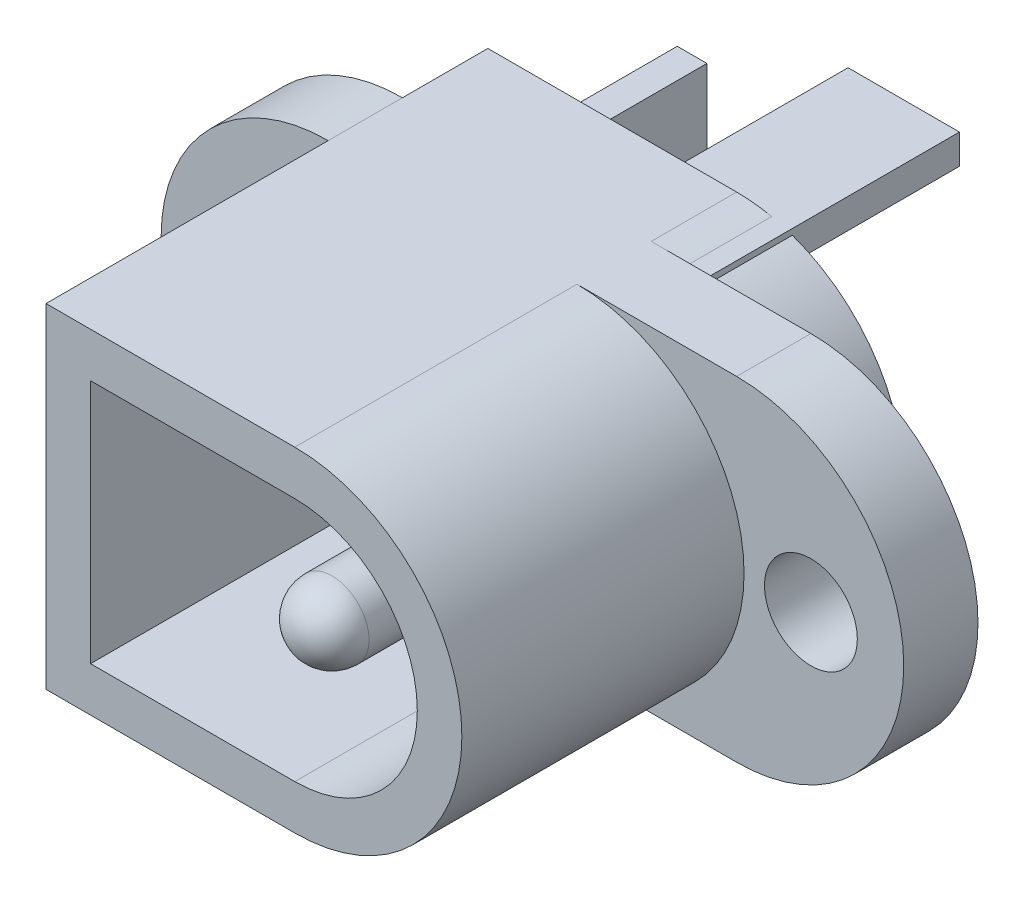
ISO-10303-21;
HEADER;
FILE_DESCRIPTION(('STEP AP214'),'2;1');
FILE_NAME('part.step','',(''),(''),'','','');
FILE_SCHEMA(('AUTOMOTIVE_DESIGN { 1 0 10303 214 1 1 1 1 }'));
ENDSEC;
DATA;
#1=APPLICATION_CONTEXT('core data for automotive mechanical design processes');
#2=APPLICATION_PROTOCOL_DEFINITION('international standard','automotive_design',2000,#1);
#3=PRODUCT_CONTEXT('',#1,'mechanical');
#4=PRODUCT('Part','Part','',(#3));
#5=PRODUCT_RELATED_PRODUCT_CATEGORY('part','',(#4));
#6=PRODUCT_DEFINITION_FORMATION('','',#4);
#7=PRODUCT_DEFINITION_CONTEXT('part definition',#1,'design');
#8=PRODUCT_DEFINITION('design','',#6,#7);
#9=PRODUCT_DEFINITION_SHAPE('','',#8);
#10=(LENGTH_UNIT() NAMED_UNIT(*) SI_UNIT(.MILLI.,.METRE.));
#11=(NAMED_UNIT(*) PLANE_ANGLE_UNIT() SI_UNIT($,.RADIAN.));
#12=(NAMED_UNIT(*) SI_UNIT($,.STERADIAN.) SOLID_ANGLE_UNIT());
#13=UNCERTAINTY_MEASURE_WITH_UNIT(LENGTH_MEASURE(1.E-05),#10,'distance_accuracy_value','');
#14=(GEOMETRIC_REPRESENTATION_CONTEXT(3) GLOBAL_UNCERTAINTY_ASSIGNED_CONTEXT((#13)) GLOBAL_UNIT_ASSIGNED_CONTEXT((#10,
#11,#12)) REPRESENTATION_CONTEXT('',''));
#15=CARTESIAN_POINT('',(0.,0.,0.));
#16=DIRECTION('',(0.,0.,1.));
#17=DIRECTION('',(1.,0.,0.));
#18=AXIS2_PLACEMENT_3D('',#15,#16,#17);
#19=CARTESIAN_POINT('',(0.,0.,0.));
#20=DIRECTION('',(0.,0.,1.));
#21=DIRECTION('',(1.,0.,0.));
#22=AXIS2_PLACEMENT_3D('',#19,#20,#21);
#23=PLANE('',#22);
#24=CARTESIAN_POINT('',(-8.8,0.,0.));
#25=DIRECTION('',(0.,0.,1.));
#26=DIRECTION('',(1.,0.,0.));
#27=AXIS2_PLACEMENT_3D('',#24,#25,#26);
#28=CIRCLE('',#27,1.25);
#29=CARTESIAN_POINT('',(-7.55,0.,0.));
#30=VERTEX_POINT('',#29);
#31=EDGE_CURVE('E416',#30,#30,#28,.T.);
#32=ORIENTED_EDGE('',*,*,#31,.T.);
#33=EDGE_LOOP('',(#32));
#34=FACE_BOUND('',#33,.T.);
#35=CARTESIAN_POINT('',(-6.7,0.,0.));
#36=DIRECTION('',(0.,0.,1.));
#37=DIRECTION('',(1.,0.,0.));
#38=AXIS2_PLACEMENT_3D('',#35,#36,#37);
#39=CIRCLE('',#38,4.5);
#40=CARTESIAN_POINT('',(-6.7,4.5,0.));
#41=VERTEX_POINT('',#40);
#42=CARTESIAN_POINT('',(-6.7,-4.5,0.));
#43=VERTEX_POINT('',#42);
#44=EDGE_CURVE('E438',#41,#43,#39,.T.);
#45=ORIENTED_EDGE('',*,*,#44,.F.);
#46=DIRECTION('',(0.,-1.,0.));
#47=VECTOR('',#46,1.);
#48=CARTESIAN_POINT('',(-6.7,0.,0.));
#49=LINE('',#48,#47);
#50=EDGE_CURVE('E316',#41,#43,#49,.T.);
#51=ORIENTED_EDGE('',*,*,#50,.T.);
#52=EDGE_LOOP('',(#45,#51));
#53=FACE_BOUND('',#52,.T.);
#54=ADVANCED_FACE('F67',(#34,#53),#23,.F.);
#55=CARTESIAN_POINT('',(-1.5,3.6,9.602));
#56=DIRECTION('',(0.,-1.,0.));
#57=DIRECTION('',(1.,0.,0.));
#58=AXIS2_PLACEMENT_3D('',#55,#56,#57);
#59=PLANE('',#58);
#60=DIRECTION('',(0.,0.,-1.));
#61=VECTOR('',#60,1.);
#62=CARTESIAN_POINT('',(1.5,3.6,9.602));
#63=LINE('',#62,#61);
#64=CARTESIAN_POINT('',(1.5,3.6,-2.3));
#65=VERTEX_POINT('',#64);
#66=CARTESIAN_POINT('',(1.5,3.6,-6.8));
#67=VERTEX_POINT('',#66);
#68=EDGE_CURVE('E366',#65,#67,#63,.T.);
#69=ORIENTED_EDGE('',*,*,#68,.F.);
#70=DIRECTION('',(-1.,0.,0.));
#71=VECTOR('',#70,1.);
#72=CARTESIAN_POINT('',(-1.5,3.6,-2.3));
#73=LINE('',#72,#71);
#74=CARTESIAN_POINT('',(-1.5,3.6,-2.3));
#75=VERTEX_POINT('',#74);
#76=EDGE_CURVE('E345',#65,#75,#73,.T.);
#77=ORIENTED_EDGE('',*,*,#76,.T.);
#78=DIRECTION('',(0.,0.,-1.));
#79=VECTOR('',#78,1.);
#80=CARTESIAN_POINT('',(-1.5,3.6,9.602));
#81=LINE('',#80,#79);
#82=CARTESIAN_POINT('',(-1.5,3.6,-6.8));
#83=VERTEX_POINT('',#82);
#84=EDGE_CURVE('E369',#75,#83,#81,.T.);
#85=ORIENTED_EDGE('',*,*,#84,.T.);
#86=DIRECTION('',(-1.,0.,0.));
#87=VECTOR('',#86,1.);
#88=CARTESIAN_POINT('',(-1.5,3.6,-6.8));
#89=LINE('',#88,#87);
#90=EDGE_CURVE('E356',#67,#83,#89,.T.);
#91=ORIENTED_EDGE('',*,*,#90,.F.);
#92=EDGE_LOOP('',(#69,#77,#85,#91));
#93=FACE_BOUND('',#92,.T.);
#94=ADVANCED_FACE('F528',(#93),#59,.T.);
#95=CARTESIAN_POINT('',(-1.5,3.6,9.602));
#96=DIRECTION('',(-1.,0.,0.));
#97=DIRECTION('',(0.,0.,1.));
#98=AXIS2_PLACEMENT_3D('',#95,#96,#97);
#99=PLANE('',#98);
#100=ORIENTED_EDGE('',*,*,#84,.F.);
#101=DIRECTION('',(0.,1.,0.));
#102=VECTOR('',#101,1.);
#103=CARTESIAN_POINT('',(-1.5,3.6,-2.3));
#104=LINE('',#103,#102);
#105=CARTESIAN_POINT('',(-1.5,4.4,-2.3));
#106=VERTEX_POINT('',#105);
#107=EDGE_CURVE('E342',#75,#106,#104,.T.);
#108=ORIENTED_EDGE('',*,*,#107,.T.);
#109=DIRECTION('',(0.,0.,-1.));
#110=VECTOR('',#109,1.);
#111=CARTESIAN_POINT('',(-1.5,4.4,9.602));
#112=LINE('',#111,#110);
#113=CARTESIAN_POINT('',(-1.5,4.4,-6.8));
#114=VERTEX_POINT('',#113);
#115=EDGE_CURVE('E371',#106,#114,#112,.T.);
#116=ORIENTED_EDGE('',*,*,#115,.T.);
#117=DIRECTION('',(0.,1.,0.));
#118=VECTOR('',#117,1.);
#119=CARTESIAN_POINT('',(-1.5,3.6,-6.8));
#120=LINE('',#119,#118);
#121=EDGE_CURVE('E359',#83,#114,#120,.T.);
#122=ORIENTED_EDGE('',*,*,#121,.F.);
#123=EDGE_LOOP('',(#100,#108,#116,#122));
#124=FACE_BOUND('',#123,.T.);
#125=ADVANCED_FACE('F535',(#124),#99,.T.);
#126=CARTESIAN_POINT('',(6.3,0.,0.));
#127=DIRECTION('',(0.,0.,1.));
#128=DIRECTION('',(1.,0.,0.));
#129=AXIS2_PLACEMENT_3D('',#126,#127,#128);
#130=CIRCLE('',#129,1.25);
#131=CARTESIAN_POINT('',(7.55,0.,0.));
#132=VERTEX_POINT('',#131);
#133=EDGE_CURVE('E421',#132,#132,#130,.T.);
#134=ORIENTED_EDGE('',*,*,#133,.T.);
#135=EDGE_LOOP('',(#134));
#136=FACE_BOUND('',#135,.T.);
#137=DIRECTION('',(-1.,0.,0.));
#138=VECTOR('',#137,1.);
#139=CARTESIAN_POINT('',(0.,-4.5,0.));
#140=LINE('',#139,#138);
#141=CARTESIAN_POINT('',(4.3,-4.5,0.));
#142=VERTEX_POINT('',#141);
#143=CARTESIAN_POINT('',(0.,-4.5,0.));
#144=VERTEX_POINT('',#143);
#145=EDGE_CURVE('E441',#142,#144,#140,.T.);
#146=ORIENTED_EDGE('',*,*,#145,.T.);
#147=CARTESIAN_POINT('',(0.,0.,0.));
#148=DIRECTION('',(0.,0.,1.));
#149=DIRECTION('',(1.,0.,0.));
#150=AXIS2_PLACEMENT_3D('',#147,#148,#149);
#151=CIRCLE('',#150,4.5);
#152=CARTESIAN_POINT('',(1.5,4.24264068711928,0.));
#153=VERTEX_POINT('',#152);
#154=EDGE_CURVE('E327',#144,#153,#151,.T.);
#155=ORIENTED_EDGE('',*,*,#154,.T.);
#156=DIRECTION('',(0.,-1.,0.));
#157=VECTOR('',#156,1.);
#158=CARTESIAN_POINT('',(1.5,3.6,0.));
#159=LINE('',#158,#157);
#160=CARTESIAN_POINT('',(1.5,4.4,0.));
#161=VERTEX_POINT('',#160);
#162=EDGE_CURVE('E375',#161,#153,#159,.T.);
#163=ORIENTED_EDGE('',*,*,#162,.F.);
#164=DIRECTION('',(1.,0.,0.));
#165=VECTOR('',#164,1.);
#166=CARTESIAN_POINT('',(-1.5,4.4,0.));
#167=LINE('',#166,#165);
#168=CARTESIAN_POINT('',(0.943398113205668,4.4,0.));
#169=VERTEX_POINT('',#168);
#170=EDGE_CURVE('E368',#169,#161,#167,.T.);
#171=ORIENTED_EDGE('',*,*,#170,.F.);
#172=CARTESIAN_POINT('',(0.,4.5,0.));
#173=VERTEX_POINT('',#172);
#174=EDGE_CURVE('E312',#169,#173,#151,.T.);
#175=ORIENTED_EDGE('',*,*,#174,.T.);
#176=DIRECTION('',(1.,0.,0.));
#177=VECTOR('',#176,1.);
#178=CARTESIAN_POINT('',(0.,4.5,0.));
#179=LINE('',#178,#177);
#180=CARTESIAN_POINT('',(4.3,4.5,0.));
#181=VERTEX_POINT('',#180);
#182=EDGE_CURVE('E447',#173,#181,#179,.T.);
#183=ORIENTED_EDGE('',*,*,#182,.T.);
#184=CARTESIAN_POINT('',(4.3,0.,0.));
#185=DIRECTION('',(0.,0.,1.));
#186=DIRECTION('',(1.,0.,0.));
#187=AXIS2_PLACEMENT_3D('',#184,#185,#186);
#188=CIRCLE('',#187,4.5);
#189=EDGE_CURVE('E444',#142,#181,#188,.T.);
#190=ORIENTED_EDGE('',*,*,#189,.F.);
#191=EDGE_LOOP('',(#146,#155,#163,#171,#175,#183,#190));
#192=FACE_BOUND('',#191,.T.);
#193=ADVANCED_FACE('F531',(#136,#192),#23,.F.);
#194=CARTESIAN_POINT('',(0.,0.,2.));
#195=DIRECTION('',(0.,0.,1.));
#196=DIRECTION('',(1.,0.,0.));
#197=AXIS2_PLACEMENT_3D('',#194,#195,#196);
#198=PLANE('',#197);
#199=CARTESIAN_POINT('',(6.3,0.,2.));
#200=DIRECTION('',(0.,0.,1.));
#201=DIRECTION('',(1.,0.,0.));
#202=AXIS2_PLACEMENT_3D('',#199,#200,#201);
#203=CIRCLE('',#202,1.25);
#204=CARTESIAN_POINT('',(7.55,0.,2.));
#205=VERTEX_POINT('',#204);
#206=EDGE_CURVE('E432',#205,#205,#203,.T.);
#207=ORIENTED_EDGE('',*,*,#206,.F.);
#208=EDGE_LOOP('',(#207));
#209=FACE_BOUND('',#208,.T.);
#210=DIRECTION('',(1.,0.,0.));
#211=VECTOR('',#210,1.);
#212=CARTESIAN_POINT('',(0.,4.5,2.));
#213=LINE('',#212,#211);
#214=CARTESIAN_POINT('',(0.,4.5,2.));
#215=VERTEX_POINT('',#214);
#216=CARTESIAN_POINT('',(4.3,4.5,2.));
#217=VERTEX_POINT('',#216);
#218=EDGE_CURVE('E430',#215,#217,#213,.T.);
#219=ORIENTED_EDGE('',*,*,#218,.F.);
#220=CARTESIAN_POINT('',(0.,0.,2.));
#221=DIRECTION('',(0.,0.,1.));
#222=DIRECTION('',(1.,0.,0.));
#223=AXIS2_PLACEMENT_3D('',#220,#221,#222);
#224=CIRCLE('',#223,4.5);
#225=CARTESIAN_POINT('',(0.,-4.5,2.));
#226=VERTEX_POINT('',#225);
#227=EDGE_CURVE('E413',#215,#226,#224,.F.);
#228=ORIENTED_EDGE('',*,*,#227,.T.);
#229=DIRECTION('',(-1.,0.,0.));
#230=VECTOR('',#229,1.);
#231=CARTESIAN_POINT('',(0.,-4.5,2.));
#232=LINE('',#231,#230);
#233=CARTESIAN_POINT('',(4.3,-4.5,2.));
#234=VERTEX_POINT('',#233);
#235=EDGE_CURVE('E424',#234,#226,#232,.T.);
#236=ORIENTED_EDGE('',*,*,#235,.F.);
#237=CARTESIAN_POINT('',(4.3,0.,2.));
#238=DIRECTION('',(0.,0.,1.));
#239=DIRECTION('',(1.,0.,0.));
#240=AXIS2_PLACEMENT_3D('',#237,#238,#239);
#241=CIRCLE('',#240,4.5);
#242=EDGE_CURVE('E427',#234,#217,#241,.T.);
#243=ORIENTED_EDGE('',*,*,#242,.T.);
#244=EDGE_LOOP('',(#219,#228,#236,#243));
#245=FACE_BOUND('',#244,.T.);
#246=ADVANCED_FACE('F542',(#209,#245),#198,.T.);
#247=CARTESIAN_POINT('',(-8.8,0.,2.));
#248=DIRECTION('',(0.,0.,1.));
#249=DIRECTION('',(1.,0.,0.));
#250=AXIS2_PLACEMENT_3D('',#247,#248,#249);
#251=CIRCLE('',#250,1.25);
#252=CARTESIAN_POINT('',(-7.55,0.,2.));
#253=VERTEX_POINT('',#252);
#254=EDGE_CURVE('E417',#253,#253,#251,.T.);
#255=ORIENTED_EDGE('',*,*,#254,.F.);
#256=EDGE_LOOP('',(#255));
#257=FACE_BOUND('',#256,.T.);
#258=CARTESIAN_POINT('',(-6.7,0.,2.));
#259=DIRECTION('',(0.,0.,1.));
#260=DIRECTION('',(1.,0.,0.));
#261=AXIS2_PLACEMENT_3D('',#258,#259,#260);
#262=CIRCLE('',#261,4.5);
#263=CARTESIAN_POINT('',(-6.7,4.5,2.));
#264=VERTEX_POINT('',#263);
#265=CARTESIAN_POINT('',(-6.7,-4.5,2.));
#266=VERTEX_POINT('',#265);
#267=EDGE_CURVE('E420',#264,#266,#262,.T.);
#268=ORIENTED_EDGE('',*,*,#267,.T.);
#269=DIRECTION('',(0.,1.,0.));
#270=VECTOR('',#269,1.);
#271=CARTESIAN_POINT('',(-6.7,0.,2.));
#272=LINE('',#271,#270);
#273=EDGE_CURVE('E410',#266,#264,#272,.T.);
#274=ORIENTED_EDGE('',*,*,#273,.T.);
#275=EDGE_LOOP('',(#268,#274));
#276=FACE_BOUND('',#275,.T.);
#277=ADVANCED_FACE('F548',(#257,#276),#198,.T.);
#278=CARTESIAN_POINT('',(0.,3.3,2.));
#279=DIRECTION('',(0.,1.,0.));
#280=DIRECTION('',(-1.,0.,0.));
#281=AXIS2_PLACEMENT_3D('',#278,#279,#280);
#282=PLANE('',#281);
#283=DIRECTION('',(1.,0.,0.));
#284=VECTOR('',#283,1.);
#285=CARTESIAN_POINT('',(0.,3.3,0.));
#286=LINE('',#285,#284);
#287=CARTESIAN_POINT('',(-5.5,3.3,0.));
#288=VERTEX_POINT('',#287);
#289=CARTESIAN_POINT('',(0.,3.3,0.));
#290=VERTEX_POINT('',#289);
#291=EDGE_CURVE('E449',#288,#290,#286,.T.);
#292=ORIENTED_EDGE('',*,*,#291,.T.);
#293=DIRECTION('',(0.,0.,-1.));
#294=VECTOR('',#293,1.);
#295=CARTESIAN_POINT('',(0.,3.3,2.));
#296=LINE('',#295,#294);
#297=CARTESIAN_POINT('',(0.,3.3,9.6));
#298=VERTEX_POINT('',#297);
#299=EDGE_CURVE('E472',#298,#290,#296,.T.);
#300=ORIENTED_EDGE('',*,*,#299,.F.);
#301=DIRECTION('',(1.,0.,0.));
#302=VECTOR('',#301,1.);
#303=CARTESIAN_POINT('',(0.,3.3,9.6));
#304=LINE('',#303,#302);
#305=CARTESIAN_POINT('',(-5.5,3.3,9.6));
#306=VERTEX_POINT('',#305);
#307=EDGE_CURVE('E388',#306,#298,#304,.T.);
#308=ORIENTED_EDGE('',*,*,#307,.F.);
#309=DIRECTION('',(0.,0.,-1.));
#310=VECTOR('',#309,1.);
#311=CARTESIAN_POINT('',(-5.5,3.3,2.));
#312=LINE('',#311,#310);
#313=EDGE_CURVE('E462',#306,#288,#312,.T.);
#314=ORIENTED_EDGE('',*,*,#313,.T.);
#315=EDGE_LOOP('',(#292,#300,#308,#314));
#316=FACE_BOUND('',#315,.T.);
#317=ADVANCED_FACE('F664',(#316),#282,.F.);
#318=CARTESIAN_POINT('',(0.,0.,2.));
#319=DIRECTION('',(0.,0.,-1.));
#320=DIRECTION('',(-1.,0.,0.));
#321=AXIS2_PLACEMENT_3D('',#318,#319,#320);
#322=CYLINDRICAL_SURFACE('',#321,3.3);
#323=CARTESIAN_POINT('',(0.,0.,0.));
#324=DIRECTION('',(0.,0.,1.));
#325=DIRECTION('',(1.,0.,0.));
#326=AXIS2_PLACEMENT_3D('',#323,#324,#325);
#327=CIRCLE('',#326,3.3);
#328=CARTESIAN_POINT('',(0.,-3.3,0.));
#329=VERTEX_POINT('',#328);
#330=EDGE_CURVE('E452',#290,#329,#327,.F.);
#331=ORIENTED_EDGE('',*,*,#330,.T.);
#332=DIRECTION('',(0.,0.,-1.));
#333=VECTOR('',#332,1.);
#334=CARTESIAN_POINT('',(0.,-3.3,2.));
#335=LINE('',#334,#333);
#336=CARTESIAN_POINT('',(0.,-3.3,9.6));
#337=VERTEX_POINT('',#336);
#338=EDGE_CURVE('E469',#337,#329,#335,.T.);
#339=ORIENTED_EDGE('',*,*,#338,.F.);
#340=CARTESIAN_POINT('',(0.,0.,9.6));
#341=DIRECTION('',(0.,0.,1.));
#342=DIRECTION('',(1.,0.,0.));
#343=AXIS2_PLACEMENT_3D('',#340,#341,#342);
#344=CIRCLE('',#343,3.3);
#345=EDGE_CURVE('E391',#298,#337,#344,.F.);
#346=ORIENTED_EDGE('',*,*,#345,.F.);
#347=ORIENTED_EDGE('',*,*,#299,.T.);
#348=EDGE_LOOP('',(#331,#339,#346,#347));
#349=FACE_BOUND('',#348,.T.);
#350=ADVANCED_FACE('F660',(#349),#322,.F.);
#351=CARTESIAN_POINT('',(0.,-3.3,2.));
#352=DIRECTION('',(0.,-1.,0.));
#353=DIRECTION('',(1.,0.,0.));
#354=AXIS2_PLACEMENT_3D('',#351,#352,#353);
#355=PLANE('',#354);
#356=DIRECTION('',(-1.,0.,0.));
#357=VECTOR('',#356,1.);
#358=CARTESIAN_POINT('',(0.,-3.3,0.));
#359=LINE('',#358,#357);
#360=CARTESIAN_POINT('',(-5.5,-3.3,0.));
#361=VERTEX_POINT('',#360);
#362=EDGE_CURVE('E455',#329,#361,#359,.T.);
#363=ORIENTED_EDGE('',*,*,#362,.T.);
#364=DIRECTION('',(0.,0.,-1.));
#365=VECTOR('',#364,1.);
#366=CARTESIAN_POINT('',(-5.5,-3.3,2.));
#367=LINE('',#366,#365);
#368=CARTESIAN_POINT('',(-5.5,-3.3,9.6));
#369=VERTEX_POINT('',#368);
#370=EDGE_CURVE('E465',#369,#361,#367,.T.);
#371=ORIENTED_EDGE('',*,*,#370,.F.);
#372=DIRECTION('',(-1.,0.,0.));
#373=VECTOR('',#372,1.);
#374=CARTESIAN_POINT('',(0.,-3.3,9.6));
#375=LINE('',#374,#373);
#376=EDGE_CURVE('E394',#337,#369,#375,.T.);
#377=ORIENTED_EDGE('',*,*,#376,.F.);
#378=ORIENTED_EDGE('',*,*,#338,.T.);
#379=EDGE_LOOP('',(#363,#371,#377,#378));
#380=FACE_BOUND('',#379,.T.);
#381=ADVANCED_FACE('F657',(#380),#355,.F.);
#382=CARTESIAN_POINT('',(-6.7,0.,2.));
#383=DIRECTION('',(0.,0.,-1.));
#384=DIRECTION('',(-1.,0.,0.));
#385=AXIS2_PLACEMENT_3D('',#382,#383,#384);
#386=CYLINDRICAL_SURFACE('',#385,4.5);
#387=ORIENTED_EDGE('',*,*,#44,.T.);
#388=DIRECTION('',(0.,0.,-1.));
#389=VECTOR('',#388,1.);
#390=CARTESIAN_POINT('',(-6.7,-4.5,2.));
#391=LINE('',#390,#389);
#392=EDGE_CURVE('E466',#266,#43,#391,.T.);
#393=ORIENTED_EDGE('',*,*,#392,.F.);
#394=ORIENTED_EDGE('',*,*,#267,.F.);
#395=DIRECTION('',(0.,0.,-1.));
#396=VECTOR('',#395,1.);
#397=CARTESIAN_POINT('',(-6.7,4.5,2.));
#398=LINE('',#397,#396);
#399=EDGE_CURVE('E435',#264,#41,#398,.T.);
#400=ORIENTED_EDGE('',*,*,#399,.T.);
#401=EDGE_LOOP('',(#387,#393,#394,#400));
#402=FACE_BOUND('',#401,.T.);
#403=ADVANCED_FACE('F611',(#402),#386,.T.);
#404=CARTESIAN_POINT('',(0.,-4.5,2.));
#405=DIRECTION('',(0.,-1.,0.));
#406=DIRECTION('',(0.,0.,-1.));
#407=AXIS2_PLACEMENT_3D('',#404,#405,#406);
#408=PLANE('',#407);
#409=ORIENTED_EDGE('',*,*,#235,.T.);
#410=DIRECTION('',(0.,0.,-1.));
#411=VECTOR('',#410,1.);
#412=CARTESIAN_POINT('',(0.,-4.5,9.6));
#413=LINE('',#412,#411);
#414=CARTESIAN_POINT('',(0.,-4.5,9.6));
#415=VERTEX_POINT('',#414);
#416=EDGE_CURVE('E408',#415,#226,#413,.T.);
#417=ORIENTED_EDGE('',*,*,#416,.F.);
#418=DIRECTION('',(-1.,0.,0.));
#419=VECTOR('',#418,1.);
#420=CARTESIAN_POINT('',(0.,-4.5,9.6));
#421=LINE('',#420,#419);
#422=CARTESIAN_POINT('',(-6.7,-4.5,9.6));
#423=VERTEX_POINT('',#422);
#424=EDGE_CURVE('E378',#415,#423,#421,.T.);
#425=ORIENTED_EDGE('',*,*,#424,.T.);
#426=DIRECTION('',(0.,0.,-1.));
#427=VECTOR('',#426,1.);
#428=CARTESIAN_POINT('',(-6.7,-4.5,9.6));
#429=LINE('',#428,#427);
#430=EDGE_CURVE('E400',#423,#266,#429,.T.);
#431=ORIENTED_EDGE('',*,*,#430,.T.);
#432=ORIENTED_EDGE('',*,*,#392,.T.);
#433=DIRECTION('',(0.,0.,1.));
#434=VECTOR('',#433,1.);
#435=CARTESIAN_POINT('',(-6.7,-4.5,-2.3));
#436=LINE('',#435,#434);
#437=CARTESIAN_POINT('',(-6.7,-4.5,-2.3));
#438=VERTEX_POINT('',#437);
#439=EDGE_CURVE('E332',#438,#43,#436,.T.);
#440=ORIENTED_EDGE('',*,*,#439,.F.);
#441=DIRECTION('',(-1.,0.,0.));
#442=VECTOR('',#441,1.);
#443=CARTESIAN_POINT('',(0.,-4.5,-2.3));
#444=LINE('',#443,#442);
#445=CARTESIAN_POINT('',(0.,-4.5,-2.3));
#446=VERTEX_POINT('',#445);
#447=EDGE_CURVE('E313',#446,#438,#444,.T.);
#448=ORIENTED_EDGE('',*,*,#447,.F.);
#449=DIRECTION('',(0.,0.,1.));
#450=VECTOR('',#449,1.);
#451=CARTESIAN_POINT('',(0.,-4.5,-2.3));
#452=LINE('',#451,#450);
#453=EDGE_CURVE('E326',#446,#144,#452,.T.);
#454=ORIENTED_EDGE('',*,*,#453,.T.);
#455=ORIENTED_EDGE('',*,*,#145,.F.);
#456=DIRECTION('',(0.,0.,-1.));
#457=VECTOR('',#456,1.);
#458=CARTESIAN_POINT('',(4.3,-4.5,2.));
#459=LINE('',#458,#457);
#460=EDGE_CURVE('E481',#234,#142,#459,.T.);
#461=ORIENTED_EDGE('',*,*,#460,.F.);
#462=EDGE_LOOP('',(#409,#417,#425,#431,#432,#440,#448,#454,#455,#461));
#463=FACE_BOUND('',#462,.T.);
#464=ADVANCED_FACE('F559',(#463),#408,.T.);
#465=CARTESIAN_POINT('',(4.3,0.,2.));
#466=DIRECTION('',(0.,0.,-1.));
#467=DIRECTION('',(-1.,0.,0.));
#468=AXIS2_PLACEMENT_3D('',#465,#466,#467);
#469=CYLINDRICAL_SURFACE('',#468,4.5);
#470=ORIENTED_EDGE('',*,*,#189,.T.);
#471=DIRECTION('',(0.,0.,-1.));
#472=VECTOR('',#471,1.);
#473=CARTESIAN_POINT('',(4.3,4.5,2.));
#474=LINE('',#473,#472);
#475=EDGE_CURVE('E478',#217,#181,#474,.T.);
#476=ORIENTED_EDGE('',*,*,#475,.F.);
#477=ORIENTED_EDGE('',*,*,#242,.F.);
#478=ORIENTED_EDGE('',*,*,#460,.T.);
#479=EDGE_LOOP('',(#470,#476,#477,#478));
#480=FACE_BOUND('',#479,.T.);
#481=ADVANCED_FACE('F590',(#480),#469,.T.);
#482=CARTESIAN_POINT('',(-5.5,0.,2.));
#483=DIRECTION('',(-1.,0.,0.));
#484=DIRECTION('',(0.,0.,1.));
#485=AXIS2_PLACEMENT_3D('',#482,#483,#484);
#486=PLANE('',#485);
#487=DIRECTION('',(0.,1.,0.));
#488=VECTOR('',#487,1.);
#489=CARTESIAN_POINT('',(-5.5,0.,0.));
#490=LINE('',#489,#488);
#491=EDGE_CURVE('E458',#361,#288,#490,.T.);
#492=ORIENTED_EDGE('',*,*,#491,.T.);
#493=ORIENTED_EDGE('',*,*,#313,.F.);
#494=DIRECTION('',(0.,1.,0.));
#495=VECTOR('',#494,1.);
#496=CARTESIAN_POINT('',(-5.5,0.,9.6));
#497=LINE('',#496,#495);
#498=EDGE_CURVE('E397',#369,#306,#497,.T.);
#499=ORIENTED_EDGE('',*,*,#498,.F.);
#500=ORIENTED_EDGE('',*,*,#370,.T.);
#501=EDGE_LOOP('',(#492,#493,#499,#500));
#502=FACE_BOUND('',#501,.T.);
#503=ADVANCED_FACE('F653',(#502),#486,.F.);
#504=CARTESIAN_POINT('',(0.,4.5,2.));
#505=DIRECTION('',(0.,1.,0.));
#506=DIRECTION('',(0.,0.,1.));
#507=AXIS2_PLACEMENT_3D('',#504,#505,#506);
#508=PLANE('',#507);
#509=DIRECTION('',(0.,0.,-1.));
#510=VECTOR('',#509,1.);
#511=CARTESIAN_POINT('',(0.,4.5,9.6));
#512=LINE('',#511,#510);
#513=CARTESIAN_POINT('',(0.,4.5,9.6));
#514=VERTEX_POINT('',#513);
#515=EDGE_CURVE('E405',#514,#215,#512,.T.);
#516=ORIENTED_EDGE('',*,*,#515,.T.);
#517=ORIENTED_EDGE('',*,*,#218,.T.);
#518=ORIENTED_EDGE('',*,*,#475,.T.);
#519=ORIENTED_EDGE('',*,*,#182,.F.);
#520=DIRECTION('',(0.,0.,1.));
#521=VECTOR('',#520,1.);
#522=CARTESIAN_POINT('',(0.,4.5,-2.3));
#523=LINE('',#522,#521);
#524=CARTESIAN_POINT('',(0.,4.5,-2.3));
#525=VERTEX_POINT('',#524);
#526=EDGE_CURVE('E337',#525,#173,#523,.T.);
#527=ORIENTED_EDGE('',*,*,#526,.F.);
#528=DIRECTION('',(1.,0.,0.));
#529=VECTOR('',#528,1.);
#530=CARTESIAN_POINT('',(0.,4.5,-2.3));
#531=LINE('',#530,#529);
#532=CARTESIAN_POINT('',(-6.7,4.5,-2.3));
#533=VERTEX_POINT('',#532);
#534=EDGE_CURVE('E320',#533,#525,#531,.T.);
#535=ORIENTED_EDGE('',*,*,#534,.F.);
#536=DIRECTION('',(0.,0.,1.));
#537=VECTOR('',#536,1.);
#538=CARTESIAN_POINT('',(-6.7,4.5,-2.3));
#539=LINE('',#538,#537);
#540=EDGE_CURVE('E335',#533,#41,#539,.T.);
#541=ORIENTED_EDGE('',*,*,#540,.T.);
#542=ORIENTED_EDGE('',*,*,#399,.F.);
#543=DIRECTION('',(0.,0.,-1.));
#544=VECTOR('',#543,1.);
#545=CARTESIAN_POINT('',(-6.7,4.5,9.6));
#546=LINE('',#545,#544);
#547=CARTESIAN_POINT('',(-6.7,4.5,9.6));
#548=VERTEX_POINT('',#547);
#549=EDGE_CURVE('E403',#548,#264,#546,.T.);
#550=ORIENTED_EDGE('',*,*,#549,.F.);
#551=DIRECTION('',(1.,0.,0.));
#552=VECTOR('',#551,1.);
#553=CARTESIAN_POINT('',(0.,4.5,9.6));
#554=LINE('',#553,#552);
#555=EDGE_CURVE('E383',#548,#514,#554,.T.);
#556=ORIENTED_EDGE('',*,*,#555,.T.);
#557=EDGE_LOOP('',(#516,#517,#518,#519,#527,#535,#541,#542,#550,#556));
#558=FACE_BOUND('',#557,.T.);
#559=ADVANCED_FACE('F585',(#558),#508,.T.);
#560=CARTESIAN_POINT('',(-8.8,0.,2.));
#561=DIRECTION('',(0.,0.,-1.));
#562=DIRECTION('',(-1.,0.,0.));
#563=AXIS2_PLACEMENT_3D('',#560,#561,#562);
#564=CYLINDRICAL_SURFACE('',#563,1.25);
#565=ORIENTED_EDGE('',*,*,#254,.T.);
#566=EDGE_LOOP('',(#565));
#567=FACE_BOUND('',#566,.T.);
#568=ORIENTED_EDGE('',*,*,#31,.F.);
#569=EDGE_LOOP('',(#568));
#570=FACE_BOUND('',#569,.T.);
#571=ADVANCED_FACE('F645',(#567,#570),#564,.F.);
#572=CARTESIAN_POINT('',(6.3,0.,2.));
#573=DIRECTION('',(0.,0.,-1.));
#574=DIRECTION('',(-1.,0.,0.));
#575=AXIS2_PLACEMENT_3D('',#572,#573,#574);
#576=CYLINDRICAL_SURFACE('',#575,1.25);
#577=ORIENTED_EDGE('',*,*,#206,.T.);
#578=EDGE_LOOP('',(#577));
#579=FACE_BOUND('',#578,.T.);
#580=ORIENTED_EDGE('',*,*,#133,.F.);
#581=EDGE_LOOP('',(#580));
#582=FACE_BOUND('',#581,.T.);
#583=ADVANCED_FACE('F641',(#579,#582),#576,.F.);
#584=CARTESIAN_POINT('',(0.,0.,9.6));
#585=DIRECTION('',(0.,0.,-1.));
#586=DIRECTION('',(-1.,0.,0.));
#587=AXIS2_PLACEMENT_3D('',#584,#585,#586);
#588=CYLINDRICAL_SURFACE('',#587,4.5);
#589=ORIENTED_EDGE('',*,*,#227,.F.);
#590=ORIENTED_EDGE('',*,*,#515,.F.);
#591=CARTESIAN_POINT('',(0.,0.,9.6));
#592=DIRECTION('',(0.,0.,1.));
#593=DIRECTION('',(1.,0.,0.));
#594=AXIS2_PLACEMENT_3D('',#591,#592,#593);
#595=CIRCLE('',#594,4.5);
#596=EDGE_CURVE('E381',#415,#514,#595,.T.);
#597=ORIENTED_EDGE('',*,*,#596,.F.);
#598=ORIENTED_EDGE('',*,*,#416,.T.);
#599=EDGE_LOOP('',(#589,#590,#597,#598));
#600=FACE_BOUND('',#599,.T.);
#601=ADVANCED_FACE('F597',(#600),#588,.T.);
#602=CARTESIAN_POINT('',(-6.7,0.,9.6));
#603=DIRECTION('',(1.,0.,0.));
#604=DIRECTION('',(0.,0.,-1.));
#605=AXIS2_PLACEMENT_3D('',#602,#603,#604);
#606=PLANE('',#605);
#607=ORIENTED_EDGE('',*,*,#273,.F.);
#608=ORIENTED_EDGE('',*,*,#430,.F.);
#609=DIRECTION('',(0.,-1.,0.));
#610=VECTOR('',#609,1.);
#611=CARTESIAN_POINT('',(-6.7,0.,9.6));
#612=LINE('',#611,#610);
#613=EDGE_CURVE('E386',#548,#423,#612,.T.);
#614=ORIENTED_EDGE('',*,*,#613,.F.);
#615=ORIENTED_EDGE('',*,*,#549,.T.);
#616=EDGE_LOOP('',(#607,#608,#614,#615));
#617=FACE_BOUND('',#616,.T.);
#618=ADVANCED_FACE('F605',(#617),#606,.F.);
#619=CARTESIAN_POINT('',(0.,0.,9.6));
#620=DIRECTION('',(0.,0.,1.));
#621=DIRECTION('',(1.,0.,0.));
#622=AXIS2_PLACEMENT_3D('',#619,#620,#621);
#623=PLANE('',#622);
#624=ORIENTED_EDGE('',*,*,#424,.F.);
#625=ORIENTED_EDGE('',*,*,#596,.T.);
#626=ORIENTED_EDGE('',*,*,#555,.F.);
#627=ORIENTED_EDGE('',*,*,#613,.T.);
#628=EDGE_LOOP('',(#624,#625,#626,#627));
#629=FACE_BOUND('',#628,.T.);
#630=ORIENTED_EDGE('',*,*,#307,.T.);
#631=ORIENTED_EDGE('',*,*,#345,.T.);
#632=ORIENTED_EDGE('',*,*,#376,.T.);
#633=ORIENTED_EDGE('',*,*,#498,.T.);
#634=EDGE_LOOP('',(#630,#631,#632,#633));
#635=FACE_BOUND('',#634,.T.);
#636=ADVANCED_FACE('F600',(#629,#635),#623,.T.);
#637=CARTESIAN_POINT('',(1.5,3.6,9.602));
#638=DIRECTION('',(1.,0.,0.));
#639=DIRECTION('',(0.,0.,-1.));
#640=AXIS2_PLACEMENT_3D('',#637,#638,#639);
#641=PLANE('',#640);
#642=DIRECTION('',(0.,0.,1.));
#643=VECTOR('',#642,1.);
#644=CARTESIAN_POINT('',(1.5,4.24264068711928,-2.3));
#645=LINE('',#644,#643);
#646=CARTESIAN_POINT('',(1.5,4.24264068711928,-2.3));
#647=VERTEX_POINT('',#646);
#648=EDGE_CURVE('E351',#647,#153,#645,.T.);
#649=ORIENTED_EDGE('',*,*,#648,.F.);
#650=DIRECTION('',(0.,-1.,0.));
#651=VECTOR('',#650,1.);
#652=CARTESIAN_POINT('',(1.5,3.6,-2.3));
#653=LINE('',#652,#651);
#654=EDGE_CURVE('E348',#647,#65,#653,.T.);
#655=ORIENTED_EDGE('',*,*,#654,.T.);
#656=ORIENTED_EDGE('',*,*,#68,.T.);
#657=DIRECTION('',(0.,-1.,0.));
#658=VECTOR('',#657,1.);
#659=CARTESIAN_POINT('',(1.5,3.6,-6.8));
#660=LINE('',#659,#658);
#661=CARTESIAN_POINT('',(1.5,4.4,-6.8));
#662=VERTEX_POINT('',#661);
#663=EDGE_CURVE('E353',#662,#67,#660,.T.);
#664=ORIENTED_EDGE('',*,*,#663,.F.);
#665=DIRECTION('',(0.,0.,-1.));
#666=VECTOR('',#665,1.);
#667=CARTESIAN_POINT('',(1.5,4.4,9.602));
#668=LINE('',#667,#666);
#669=EDGE_CURVE('E365',#161,#662,#668,.T.);
#670=ORIENTED_EDGE('',*,*,#669,.F.);
#671=ORIENTED_EDGE('',*,*,#162,.T.);
#672=EDGE_LOOP('',(#649,#655,#656,#664,#670,#671));
#673=FACE_BOUND('',#672,.T.);
#674=ADVANCED_FACE('F568',(#673),#641,.T.);
#675=CARTESIAN_POINT('',(-1.5,4.4,9.602));
#676=DIRECTION('',(0.,1.,0.));
#677=DIRECTION('',(-1.,0.,0.));
#678=AXIS2_PLACEMENT_3D('',#675,#676,#677);
#679=PLANE('',#678);
#680=DIRECTION('',(0.,0.,1.));
#681=VECTOR('',#680,1.);
#682=CARTESIAN_POINT('',(0.943398113205668,4.4,-2.3));
#683=LINE('',#682,#681);
#684=CARTESIAN_POINT('',(0.943398113205668,4.4,-2.3));
#685=VERTEX_POINT('',#684);
#686=EDGE_CURVE('E487',#169,#685,#683,.F.);
#687=ORIENTED_EDGE('',*,*,#686,.F.);
#688=ORIENTED_EDGE('',*,*,#170,.T.);
#689=ORIENTED_EDGE('',*,*,#669,.T.);
#690=DIRECTION('',(1.,0.,0.));
#691=VECTOR('',#690,1.);
#692=CARTESIAN_POINT('',(-1.5,4.4,-6.8));
#693=LINE('',#692,#691);
#694=EDGE_CURVE('E362',#114,#662,#693,.T.);
#695=ORIENTED_EDGE('',*,*,#694,.F.);
#696=ORIENTED_EDGE('',*,*,#115,.F.);
#697=DIRECTION('',(1.,0.,0.));
#698=VECTOR('',#697,1.);
#699=CARTESIAN_POINT('',(-1.5,4.4,-2.3));
#700=LINE('',#699,#698);
#701=EDGE_CURVE('E475',#106,#685,#700,.T.);
#702=ORIENTED_EDGE('',*,*,#701,.T.);
#703=EDGE_LOOP('',(#687,#688,#689,#695,#696,#702));
#704=FACE_BOUND('',#703,.T.);
#705=ADVANCED_FACE('F577',(#704),#679,.T.);
#706=CARTESIAN_POINT('',(0.,0.,-6.8));
#707=DIRECTION('',(0.,0.,-1.));
#708=DIRECTION('',(-1.,0.,0.));
#709=AXIS2_PLACEMENT_3D('',#706,#707,#708);
#710=PLANE('',#709);
#711=ORIENTED_EDGE('',*,*,#663,.T.);
#712=ORIENTED_EDGE('',*,*,#90,.T.);
#713=ORIENTED_EDGE('',*,*,#121,.T.);
#714=ORIENTED_EDGE('',*,*,#694,.T.);
#715=EDGE_LOOP('',(#711,#712,#713,#714));
#716=FACE_BOUND('',#715,.T.);
#717=ADVANCED_FACE('F620',(#716),#710,.T.);
#718=CARTESIAN_POINT('',(0.,0.,-2.3));
#719=DIRECTION('',(0.,0.,1.));
#720=DIRECTION('',(1.,0.,0.));
#721=AXIS2_PLACEMENT_3D('',#718,#719,#720);
#722=PLANE('',#721);
#723=DIRECTION('',(0.,-1.,0.));
#724=VECTOR('',#723,1.);
#725=CARTESIAN_POINT('',(-3.7,0.,-2.3));
#726=LINE('',#725,#724);
#727=CARTESIAN_POINT('',(-3.7,0.,-2.3));
#728=VERTEX_POINT('',#727);
#729=CARTESIAN_POINT('',(-3.7,-3.,-2.3));
#730=VERTEX_POINT('',#729);
#731=EDGE_CURVE('E287',#728,#730,#726,.T.);
#732=ORIENTED_EDGE('',*,*,#731,.T.);
#733=DIRECTION('',(1.,0.,0.));
#734=VECTOR('',#733,1.);
#735=CARTESIAN_POINT('',(0.,-3.,-2.3));
#736=LINE('',#735,#734);
#737=CARTESIAN_POINT('',(-2.9,-3.,-2.3));
#738=VERTEX_POINT('',#737);
#739=EDGE_CURVE('E291',#730,#738,#736,.T.);
#740=ORIENTED_EDGE('',*,*,#739,.T.);
#741=DIRECTION('',(0.,1.,0.));
#742=VECTOR('',#741,1.);
#743=CARTESIAN_POINT('',(-2.9,0.,-2.3));
#744=LINE('',#743,#742);
#745=CARTESIAN_POINT('',(-2.9,0.,-2.3));
#746=VERTEX_POINT('',#745);
#747=EDGE_CURVE('E259',#738,#746,#744,.T.);
#748=ORIENTED_EDGE('',*,*,#747,.T.);
#749=DIRECTION('',(-1.,0.,0.));
#750=VECTOR('',#749,1.);
#751=CARTESIAN_POINT('',(0.,0.,-2.3));
#752=LINE('',#751,#750);
#753=EDGE_CURVE('E284',#746,#728,#752,.T.);
#754=ORIENTED_EDGE('',*,*,#753,.T.);
#755=EDGE_LOOP('',(#732,#740,#748,#754));
#756=FACE_BOUND('',#755,.T.);
#757=DIRECTION('',(0.,-1.,0.));
#758=VECTOR('',#757,1.);
#759=CARTESIAN_POINT('',(-6.1,0.,-2.3));
#760=LINE('',#759,#758);
#761=CARTESIAN_POINT('',(-6.1,2.6,-2.3));
#762=VERTEX_POINT('',#761);
#763=CARTESIAN_POINT('',(-6.1,-0.399999999999999,-2.3));
#764=VERTEX_POINT('',#763);
#765=EDGE_CURVE('E493',#762,#764,#760,.T.);
#766=ORIENTED_EDGE('',*,*,#765,.T.);
#767=DIRECTION('',(1.,0.,0.));
#768=VECTOR('',#767,1.);
#769=CARTESIAN_POINT('',(0.,-0.4,-2.3));
#770=LINE('',#769,#768);
#771=CARTESIAN_POINT('',(-5.3,-0.399999999999999,-2.3));
#772=VERTEX_POINT('',#771);
#773=EDGE_CURVE('E75',#764,#772,#770,.T.);
#774=ORIENTED_EDGE('',*,*,#773,.T.);
#775=DIRECTION('',(0.,1.,0.));
#776=VECTOR('',#775,1.);
#777=CARTESIAN_POINT('',(-5.3,0.,-2.3));
#778=LINE('',#777,#776);
#779=CARTESIAN_POINT('',(-5.3,2.6,-2.3));
#780=VERTEX_POINT('',#779);
#781=EDGE_CURVE('E496',#772,#780,#778,.T.);
#782=ORIENTED_EDGE('',*,*,#781,.T.);
#783=DIRECTION('',(-1.,0.,0.));
#784=VECTOR('',#783,1.);
#785=CARTESIAN_POINT('',(0.,2.6,-2.3));
#786=LINE('',#785,#784);
#787=EDGE_CURVE('E490',#780,#762,#786,.T.);
#788=ORIENTED_EDGE('',*,*,#787,.T.);
#789=EDGE_LOOP('',(#766,#774,#782,#788));
#790=FACE_BOUND('',#789,.T.);
#791=ORIENTED_EDGE('',*,*,#654,.F.);
#792=CARTESIAN_POINT('',(0.,0.,-2.3));
#793=DIRECTION('',(0.,0.,1.));
#794=DIRECTION('',(1.,0.,0.));
#795=AXIS2_PLACEMENT_3D('',#792,#793,#794);
#796=CIRCLE('',#795,4.5);
#797=EDGE_CURVE('E317',#446,#647,#796,.T.);
#798=ORIENTED_EDGE('',*,*,#797,.F.);
#799=ORIENTED_EDGE('',*,*,#447,.T.);
#800=DIRECTION('',(0.,-1.,0.));
#801=VECTOR('',#800,1.);
#802=CARTESIAN_POINT('',(-6.7,0.,-2.3));
#803=LINE('',#802,#801);
#804=EDGE_CURVE('E323',#533,#438,#803,.T.);
#805=ORIENTED_EDGE('',*,*,#804,.F.);
#806=ORIENTED_EDGE('',*,*,#534,.T.);
#807=EDGE_CURVE('E315',#685,#525,#796,.T.);
#808=ORIENTED_EDGE('',*,*,#807,.F.);
#809=ORIENTED_EDGE('',*,*,#701,.F.);
#810=ORIENTED_EDGE('',*,*,#107,.F.);
#811=ORIENTED_EDGE('',*,*,#76,.F.);
#812=EDGE_LOOP('',(#791,#798,#799,#805,#806,#808,#809,#810,#811));
#813=FACE_BOUND('',#812,.T.);
#814=ADVANCED_FACE('F500',(#756,#790,#813),#722,.F.);
#815=CARTESIAN_POINT('',(0.,0.,-2.3));
#816=DIRECTION('',(0.,0.,1.));
#817=DIRECTION('',(1.,0.,0.));
#818=AXIS2_PLACEMENT_3D('',#815,#816,#817);
#819=CYLINDRICAL_SURFACE('',#818,4.5);
#820=ORIENTED_EDGE('',*,*,#174,.F.);
#821=ORIENTED_EDGE('',*,*,#686,.T.);
#822=ORIENTED_EDGE('',*,*,#807,.T.);
#823=ORIENTED_EDGE('',*,*,#526,.T.);
#824=EDGE_LOOP('',(#820,#821,#822,#823));
#825=FACE_BOUND('',#824,.T.);
#826=ADVANCED_FACE('F581',(#825),#819,.T.);
#827=ORIENTED_EDGE('',*,*,#797,.T.);
#828=ORIENTED_EDGE('',*,*,#648,.T.);
#829=ORIENTED_EDGE('',*,*,#154,.F.);
#830=ORIENTED_EDGE('',*,*,#453,.F.);
#831=EDGE_LOOP('',(#827,#828,#829,#830));
#832=FACE_BOUND('',#831,.T.);
#833=ADVANCED_FACE('F565',(#832),#819,.T.);
#834=CARTESIAN_POINT('',(-6.7,0.,-2.3));
#835=DIRECTION('',(-1.,0.,0.));
#836=DIRECTION('',(0.,0.,1.));
#837=AXIS2_PLACEMENT_3D('',#834,#835,#836);
#838=PLANE('',#837);
#839=ORIENTED_EDGE('',*,*,#50,.F.);
#840=ORIENTED_EDGE('',*,*,#540,.F.);
#841=ORIENTED_EDGE('',*,*,#804,.T.);
#842=ORIENTED_EDGE('',*,*,#439,.T.);
#843=EDGE_LOOP('',(#839,#840,#841,#842));
#844=FACE_BOUND('',#843,.T.);
#845=ADVANCED_FACE('F615',(#844),#838,.T.);
#846=CARTESIAN_POINT('',(0.,0.,0.));
#847=DIRECTION('',(0.,0.,1.));
#848=DIRECTION('',(1.,0.,0.));
#849=AXIS2_PLACEMENT_3D('',#846,#847,#848);
#850=PLANE('',#849);
#851=ORIENTED_EDGE('',*,*,#291,.F.);
#852=ORIENTED_EDGE('',*,*,#491,.F.);
#853=ORIENTED_EDGE('',*,*,#362,.F.);
#854=ORIENTED_EDGE('',*,*,#330,.F.);
#855=EDGE_LOOP('',(#851,#852,#853,#854));
#856=FACE_BOUND('',#855,.T.);
#857=CARTESIAN_POINT('',(0.,0.,0.));
#858=DIRECTION('',(0.,0.,1.));
#859=DIRECTION('',(1.,0.,0.));
#860=AXIS2_PLACEMENT_3D('',#857,#858,#859);
#861=CIRCLE('',#860,1.);
#862=CARTESIAN_POINT('',(1.,0.,0.));
#863=VERTEX_POINT('',#862);
#864=EDGE_CURVE('E334',#863,#863,#861,.T.);
#865=ORIENTED_EDGE('',*,*,#864,.F.);
#866=EDGE_LOOP('',(#865));
#867=FACE_BOUND('',#866,.T.);
#868=ADVANCED_FACE('F829',(#856,#867),#850,.T.);
#869=CARTESIAN_POINT('',(0.,0.,2.));
#870=DIRECTION('',(0.,0.,-1.));
#871=DIRECTION('',(-1.,0.,0.));
#872=AXIS2_PLACEMENT_3D('',#869,#870,#871);
#873=CYLINDRICAL_SURFACE('',#872,1.);
#874=CARTESIAN_POINT('',(0.,0.,8.6));
#875=DIRECTION('',(0.,0.,-1.));
#876=DIRECTION('',(-1.,0.,0.));
#877=AXIS2_PLACEMENT_3D('',#874,#875,#876);
#878=CIRCLE('',#877,1.);
#879=CARTESIAN_POINT('',(-1.,0.,8.6));
#880=VERTEX_POINT('',#879);
#881=EDGE_CURVE('E12',#880,#880,#878,.T.);
#882=ORIENTED_EDGE('',*,*,#881,.T.);
#883=EDGE_LOOP('',(#882));
#884=FACE_BOUND('',#883,.T.);
#885=ORIENTED_EDGE('',*,*,#864,.T.);
#886=EDGE_LOOP('',(#885));
#887=FACE_BOUND('',#886,.T.);
#888=ADVANCED_FACE('F524',(#884,#887),#873,.T.);
#889=CARTESIAN_POINT('',(-6.1,-0.399999999999999,9.602));
#890=DIRECTION('',(0.,-1.,0.));
#891=DIRECTION('',(1.,0.,0.));
#892=AXIS2_PLACEMENT_3D('',#889,#890,#891);
#893=PLANE('',#892);
#894=ORIENTED_EDGE('',*,*,#773,.F.);
#895=DIRECTION('',(0.,0.,-1.));
#896=VECTOR('',#895,1.);
#897=CARTESIAN_POINT('',(-6.1,-0.399999999999999,9.602));
#898=LINE('',#897,#896);
#899=CARTESIAN_POINT('',(-6.1,-0.399999999999999,-6.8));
#900=VERTEX_POINT('',#899);
#901=EDGE_CURVE('E307',#764,#900,#898,.T.);
#902=ORIENTED_EDGE('',*,*,#901,.T.);
#903=DIRECTION('',(-1.,0.,0.));
#904=VECTOR('',#903,1.);
#905=CARTESIAN_POINT('',(-6.1,-0.399999999999999,-6.8));
#906=LINE('',#905,#904);
#907=CARTESIAN_POINT('',(-5.3,-0.399999999999999,-6.8));
#908=VERTEX_POINT('',#907);
#909=EDGE_CURVE('E296',#908,#900,#906,.T.);
#910=ORIENTED_EDGE('',*,*,#909,.F.);
#911=DIRECTION('',(0.,0.,-1.));
#912=VECTOR('',#911,1.);
#913=CARTESIAN_POINT('',(-5.3,-0.399999999999999,9.602));
#914=LINE('',#913,#912);
#915=EDGE_CURVE('E305',#772,#908,#914,.T.);
#916=ORIENTED_EDGE('',*,*,#915,.F.);
#917=EDGE_LOOP('',(#894,#902,#910,#916));
#918=FACE_BOUND('',#917,.T.);
#919=ADVANCED_FACE('F505',(#918),#893,.T.);
#920=CARTESIAN_POINT('',(-5.3,-0.399999999999999,9.602));
#921=DIRECTION('',(1.,0.,0.));
#922=DIRECTION('',(0.,0.,-1.));
#923=AXIS2_PLACEMENT_3D('',#920,#921,#922);
#924=PLANE('',#923);
#925=ORIENTED_EDGE('',*,*,#781,.F.);
#926=ORIENTED_EDGE('',*,*,#915,.T.);
#927=DIRECTION('',(0.,-1.,0.));
#928=VECTOR('',#927,1.);
#929=CARTESIAN_POINT('',(-5.3,-0.399999999999999,-6.8));
#930=LINE('',#929,#928);
#931=CARTESIAN_POINT('',(-5.3,2.6,-6.8));
#932=VERTEX_POINT('',#931);
#933=EDGE_CURVE('E293',#932,#908,#930,.T.);
#934=ORIENTED_EDGE('',*,*,#933,.F.);
#935=DIRECTION('',(0.,0.,-1.));
#936=VECTOR('',#935,1.);
#937=CARTESIAN_POINT('',(-5.3,2.6,9.602));
#938=LINE('',#937,#936);
#939=EDGE_CURVE('E310',#780,#932,#938,.T.);
#940=ORIENTED_EDGE('',*,*,#939,.F.);
#941=EDGE_LOOP('',(#925,#926,#934,#940));
#942=FACE_BOUND('',#941,.T.);
#943=ADVANCED_FACE('F516',(#942),#924,.T.);
#944=CARTESIAN_POINT('',(-6.1,-0.399999999999999,9.602));
#945=DIRECTION('',(-1.,0.,0.));
#946=DIRECTION('',(0.,0.,1.));
#947=AXIS2_PLACEMENT_3D('',#944,#945,#946);
#948=PLANE('',#947);
#949=ORIENTED_EDGE('',*,*,#765,.F.);
#950=DIRECTION('',(0.,0.,-1.));
#951=VECTOR('',#950,1.);
#952=CARTESIAN_POINT('',(-6.1,2.6,9.602));
#953=LINE('',#952,#951);
#954=CARTESIAN_POINT('',(-6.1,2.6,-6.8));
#955=VERTEX_POINT('',#954);
#956=EDGE_CURVE('E90',#762,#955,#953,.T.);
#957=ORIENTED_EDGE('',*,*,#956,.T.);
#958=DIRECTION('',(0.,1.,0.));
#959=VECTOR('',#958,1.);
#960=CARTESIAN_POINT('',(-6.1,-0.399999999999999,-6.8));
#961=LINE('',#960,#959);
#962=EDGE_CURVE('E299',#900,#955,#961,.T.);
#963=ORIENTED_EDGE('',*,*,#962,.F.);
#964=ORIENTED_EDGE('',*,*,#901,.F.);
#965=EDGE_LOOP('',(#949,#957,#963,#964));
#966=FACE_BOUND('',#965,.T.);
#967=ADVANCED_FACE('F509',(#966),#948,.T.);
#968=CARTESIAN_POINT('',(-6.1,2.6,9.602));
#969=DIRECTION('',(0.,1.,0.));
#970=DIRECTION('',(-1.,0.,0.));
#971=AXIS2_PLACEMENT_3D('',#968,#969,#970);
#972=PLANE('',#971);
#973=ORIENTED_EDGE('',*,*,#787,.F.);
#974=ORIENTED_EDGE('',*,*,#939,.T.);
#975=DIRECTION('',(1.,0.,0.));
#976=VECTOR('',#975,1.);
#977=CARTESIAN_POINT('',(-6.1,2.6,-6.8));
#978=LINE('',#977,#976);
#979=EDGE_CURVE('E302',#955,#932,#978,.T.);
#980=ORIENTED_EDGE('',*,*,#979,.F.);
#981=ORIENTED_EDGE('',*,*,#956,.F.);
#982=EDGE_LOOP('',(#973,#974,#980,#981));
#983=FACE_BOUND('',#982,.T.);
#984=ADVANCED_FACE('F513',(#983),#972,.T.);
#985=CARTESIAN_POINT('',(0.,0.,-6.8));
#986=DIRECTION('',(0.,0.,-1.));
#987=DIRECTION('',(-1.,0.,0.));
#988=AXIS2_PLACEMENT_3D('',#985,#986,#987);
#989=PLANE('',#988);
#990=ORIENTED_EDGE('',*,*,#933,.T.);
#991=ORIENTED_EDGE('',*,*,#909,.T.);
#992=ORIENTED_EDGE('',*,*,#962,.T.);
#993=ORIENTED_EDGE('',*,*,#979,.T.);
#994=EDGE_LOOP('',(#990,#991,#992,#993));
#995=FACE_BOUND('',#994,.T.);
#996=ADVANCED_FACE('F511',(#995),#989,.T.);
#997=CARTESIAN_POINT('',(-3.7,-3.,9.602));
#998=DIRECTION('',(0.,-1.,0.));
#999=DIRECTION('',(0.,0.,-1.));
#1000=AXIS2_PLACEMENT_3D('',#997,#998,#999);
#1001=PLANE('',#1000);
#1002=ORIENTED_EDGE('',*,*,#739,.F.);
#1003=DIRECTION('',(0.,0.,-1.));
#1004=VECTOR('',#1003,1.);
#1005=CARTESIAN_POINT('',(-3.7,-3.,9.602));
#1006=LINE('',#1005,#1004);
#1007=CARTESIAN_POINT('',(-3.7,-3.,-6.8));
#1008=VERTEX_POINT('',#1007);
#1009=EDGE_CURVE('E262',#730,#1008,#1006,.T.);
#1010=ORIENTED_EDGE('',*,*,#1009,.T.);
#1011=DIRECTION('',(-1.,0.,0.));
#1012=VECTOR('',#1011,1.);
#1013=CARTESIAN_POINT('',(-3.7,-3.,-6.8));
#1014=LINE('',#1013,#1012);
#1015=CARTESIAN_POINT('',(-2.9,-3.,-6.8));
#1016=VERTEX_POINT('',#1015);
#1017=EDGE_CURVE('E266',#1016,#1008,#1014,.T.);
#1018=ORIENTED_EDGE('',*,*,#1017,.F.);
#1019=DIRECTION('',(0.,0.,-1.));
#1020=VECTOR('',#1019,1.);
#1021=CARTESIAN_POINT('',(-2.9,-3.,9.602));
#1022=LINE('',#1021,#1020);
#1023=EDGE_CURVE('E252',#738,#1016,#1022,.T.);
#1024=ORIENTED_EDGE('',*,*,#1023,.F.);
#1025=EDGE_LOOP('',(#1002,#1010,#1018,#1024));
#1026=FACE_BOUND('',#1025,.T.);
#1027=ADVANCED_FACE('F267',(#1026),#1001,.T.);
#1028=CARTESIAN_POINT('',(-2.9,-3.,9.602));
#1029=DIRECTION('',(1.,0.,0.));
#1030=DIRECTION('',(0.,1.,0.));
#1031=AXIS2_PLACEMENT_3D('',#1028,#1029,#1030);
#1032=PLANE('',#1031);
#1033=ORIENTED_EDGE('',*,*,#747,.F.);
#1034=ORIENTED_EDGE('',*,*,#1023,.T.);
#1035=DIRECTION('',(0.,-1.,0.));
#1036=VECTOR('',#1035,1.);
#1037=CARTESIAN_POINT('',(-2.9,-3.,-6.8));
#1038=LINE('',#1037,#1036);
#1039=CARTESIAN_POINT('',(-2.9,0.,-6.8));
#1040=VERTEX_POINT('',#1039);
#1041=EDGE_CURVE('E257',#1040,#1016,#1038,.T.);
#1042=ORIENTED_EDGE('',*,*,#1041,.F.);
#1043=DIRECTION('',(0.,0.,-1.));
#1044=VECTOR('',#1043,1.);
#1045=CARTESIAN_POINT('',(-2.9,0.,9.602));
#1046=LINE('',#1045,#1044);
#1047=EDGE_CURVE('E282',#746,#1040,#1046,.T.);
#1048=ORIENTED_EDGE('',*,*,#1047,.F.);
#1049=EDGE_LOOP('',(#1033,#1034,#1042,#1048));
#1050=FACE_BOUND('',#1049,.T.);
#1051=ADVANCED_FACE('F254',(#1050),#1032,.T.);
#1052=CARTESIAN_POINT('',(-3.7,-3.,9.602));
#1053=DIRECTION('',(-1.,0.,0.));
#1054=DIRECTION('',(0.,0.,1.));
#1055=AXIS2_PLACEMENT_3D('',#1052,#1053,#1054);
#1056=PLANE('',#1055);
#1057=ORIENTED_EDGE('',*,*,#731,.F.);
#1058=DIRECTION('',(0.,0.,-1.));
#1059=VECTOR('',#1058,1.);
#1060=CARTESIAN_POINT('',(-3.7,0.,9.602));
#1061=LINE('',#1060,#1059);
#1062=CARTESIAN_POINT('',(-3.7,0.,-6.8));
#1063=VERTEX_POINT('',#1062);
#1064=EDGE_CURVE('E82',#728,#1063,#1061,.T.);
#1065=ORIENTED_EDGE('',*,*,#1064,.T.);
#1066=DIRECTION('',(0.,1.,0.));
#1067=VECTOR('',#1066,1.);
#1068=CARTESIAN_POINT('',(-3.7,-3.,-6.8));
#1069=LINE('',#1068,#1067);
#1070=EDGE_CURVE('E272',#1008,#1063,#1069,.T.);
#1071=ORIENTED_EDGE('',*,*,#1070,.F.);
#1072=ORIENTED_EDGE('',*,*,#1009,.F.);
#1073=EDGE_LOOP('',(#1057,#1065,#1071,#1072));
#1074=FACE_BOUND('',#1073,.T.);
#1075=ADVANCED_FACE('F873',(#1074),#1056,.T.);
#1076=CARTESIAN_POINT('',(-3.7,0.,9.602));
#1077=DIRECTION('',(0.,1.,0.));
#1078=DIRECTION('',(0.,0.,1.));
#1079=AXIS2_PLACEMENT_3D('',#1076,#1077,#1078);
#1080=PLANE('',#1079);
#1081=ORIENTED_EDGE('',*,*,#753,.F.);
#1082=ORIENTED_EDGE('',*,*,#1047,.T.);
#1083=DIRECTION('',(1.,0.,0.));
#1084=VECTOR('',#1083,1.);
#1085=CARTESIAN_POINT('',(-3.7,0.,-6.8));
#1086=LINE('',#1085,#1084);
#1087=EDGE_CURVE('E263',#1063,#1040,#1086,.T.);
#1088=ORIENTED_EDGE('',*,*,#1087,.F.);
#1089=ORIENTED_EDGE('',*,*,#1064,.F.);
#1090=EDGE_LOOP('',(#1081,#1082,#1088,#1089));
#1091=FACE_BOUND('',#1090,.T.);
#1092=ADVANCED_FACE('F870',(#1091),#1080,.T.);
#1093=CARTESIAN_POINT('',(0.,0.,-6.8));
#1094=DIRECTION('',(0.,0.,-1.));
#1095=DIRECTION('',(-1.,0.,0.));
#1096=AXIS2_PLACEMENT_3D('',#1093,#1094,#1095);
#1097=PLANE('',#1096);
#1098=ORIENTED_EDGE('',*,*,#1041,.T.);
#1099=ORIENTED_EDGE('',*,*,#1017,.T.);
#1100=ORIENTED_EDGE('',*,*,#1070,.T.);
#1101=ORIENTED_EDGE('',*,*,#1087,.T.);
#1102=EDGE_LOOP('',(#1098,#1099,#1100,#1101));
#1103=FACE_BOUND('',#1102,.T.);
#1104=ADVANCED_FACE('F275',(#1103),#1097,.T.);
#1105=CARTESIAN_POINT('',(0.,0.,8.6));
#1106=DIRECTION('',(0.,0.,1.));
#1107=DIRECTION('',(1.,0.,0.));
#1108=AXIS2_PLACEMENT_3D('',#1105,#1106,#1107);
#1109=SPHERICAL_SURFACE('',#1108,1.);
#1110=ORIENTED_EDGE('',*,*,#881,.F.);
#1111=EDGE_LOOP('',(#1110));
#1112=FACE_BOUND('',#1111,.T.);
#1113=ADVANCED_FACE('F69',(#1112),#1109,.T.);
#1114=CLOSED_SHELL('',(#54,#94,#125,#193,#246,#277,#317,#350,#381,#403,#464,#481,#503,#559,#571,
#583,#601,#618,#636,#674,#705,#717,#814,#826,#833,#845,#868,#888,#919,#943,#967,#984,#996,#1027,
#1051,#1075,#1092,#1104,#1113));
#1115=MANIFOLD_SOLID_BREP('B2',#1114);
#1116=ADVANCED_BREP_SHAPE_REPRESENTATION('',(#18,#1115),#14);
#1117=SHAPE_DEFINITION_REPRESENTATION(#9,#1116);
ENDSEC;
END-ISO-10303-21;
